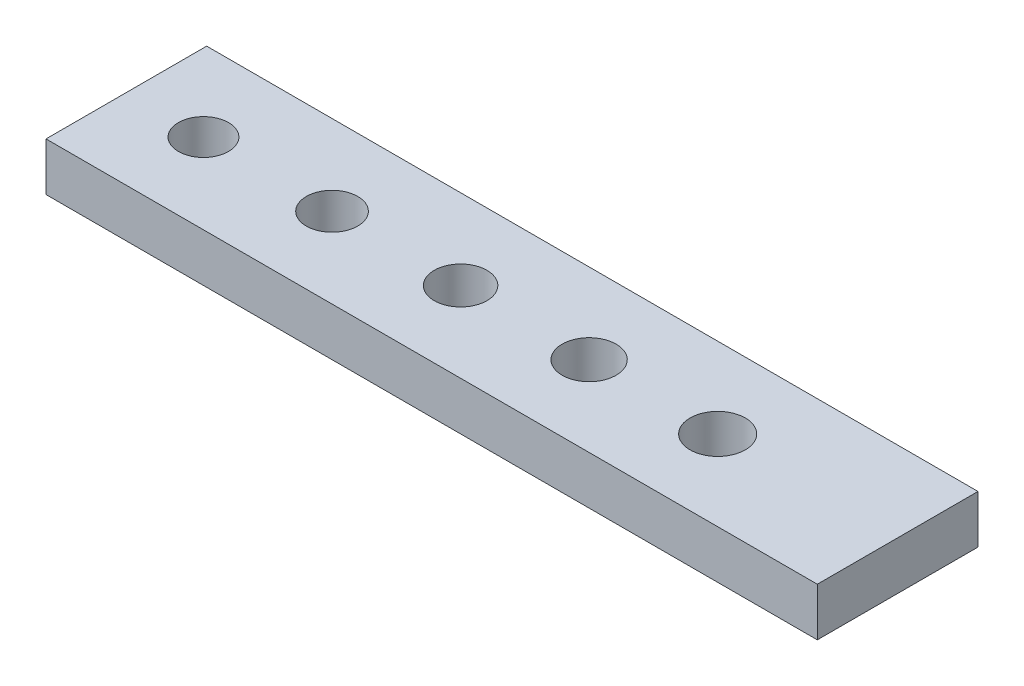
ISO-10303-21;
HEADER;
FILE_DESCRIPTION(('STEP AP214'),'2;1');
FILE_NAME('part.step','',(''),(''),'','','');
FILE_SCHEMA(('AUTOMOTIVE_DESIGN { 1 0 10303 214 1 1 1 1 }'));
ENDSEC;
DATA;
#1=APPLICATION_CONTEXT('core data for automotive mechanical design processes');
#2=APPLICATION_PROTOCOL_DEFINITION('international standard','automotive_design',2000,#1);
#3=PRODUCT_CONTEXT('',#1,'mechanical');
#4=PRODUCT('Part','Part','',(#3));
#5=PRODUCT_RELATED_PRODUCT_CATEGORY('part','',(#4));
#6=PRODUCT_DEFINITION_FORMATION('','',#4);
#7=PRODUCT_DEFINITION_CONTEXT('part definition',#1,'design');
#8=PRODUCT_DEFINITION('design','',#6,#7);
#9=PRODUCT_DEFINITION_SHAPE('','',#8);
#10=(LENGTH_UNIT() NAMED_UNIT(*) SI_UNIT(.MILLI.,.METRE.));
#11=(NAMED_UNIT(*) PLANE_ANGLE_UNIT() SI_UNIT($,.RADIAN.));
#12=(NAMED_UNIT(*) SI_UNIT($,.STERADIAN.) SOLID_ANGLE_UNIT());
#13=UNCERTAINTY_MEASURE_WITH_UNIT(LENGTH_MEASURE(1.E-05),#10,'distance_accuracy_value','');
#14=(GEOMETRIC_REPRESENTATION_CONTEXT(3) GLOBAL_UNCERTAINTY_ASSIGNED_CONTEXT((#13)) GLOBAL_UNIT_ASSIGNED_CONTEXT((#10,
#11,#12)) REPRESENTATION_CONTEXT('',''));
#15=CARTESIAN_POINT('',(0.,0.,0.));
#16=DIRECTION('',(0.,0.,1.));
#17=DIRECTION('',(1.,0.,0.));
#18=AXIS2_PLACEMENT_3D('',#15,#16,#17);
#19=CARTESIAN_POINT('',(0.,1.905,0.));
#20=DIRECTION('',(0.,-1.,0.));
#21=DIRECTION('',(0.,0.,-1.));
#22=AXIS2_PLACEMENT_3D('',#19,#20,#21);
#23=PLANE('',#22);
#24=DIRECTION('',(0.,0.,-1.));
#25=VECTOR('',#24,1.);
#26=CARTESIAN_POINT('',(0.,1.905,0.));
#27=LINE('',#26,#25);
#28=CARTESIAN_POINT('',(0.,1.905,6.35000000000001));
#29=VERTEX_POINT('',#28);
#30=CARTESIAN_POINT('',(0.,1.905,0.));
#31=VERTEX_POINT('',#30);
#32=EDGE_CURVE('E85',#29,#31,#27,.T.);
#33=ORIENTED_EDGE('',*,*,#32,.T.);
#34=DIRECTION('',(-1.,0.,0.));
#35=VECTOR('',#34,1.);
#36=CARTESIAN_POINT('',(0.,1.905,0.));
#37=LINE('',#36,#35);
#38=CARTESIAN_POINT('',(-30.48,1.905,0.));
#39=VERTEX_POINT('',#38);
#40=EDGE_CURVE('E80',#31,#39,#37,.T.);
#41=ORIENTED_EDGE('',*,*,#40,.T.);
#42=DIRECTION('',(0.,0.,1.));
#43=VECTOR('',#42,1.);
#44=CARTESIAN_POINT('',(-30.48,1.905,0.));
#45=LINE('',#44,#43);
#46=CARTESIAN_POINT('',(-30.48,1.905,6.35));
#47=VERTEX_POINT('',#46);
#48=EDGE_CURVE('E83',#39,#47,#45,.T.);
#49=ORIENTED_EDGE('',*,*,#48,.T.);
#50=DIRECTION('',(1.,0.,0.));
#51=VECTOR('',#50,1.);
#52=CARTESIAN_POINT('',(0.,1.905,6.35000000000001));
#53=LINE('',#52,#51);
#54=EDGE_CURVE('E50',#47,#29,#53,.T.);
#55=ORIENTED_EDGE('',*,*,#54,.T.);
#56=EDGE_LOOP('',(#33,#41,#49,#55));
#57=FACE_BOUND('',#56,.T.);
#58=CARTESIAN_POINT('',(-27.432,1.905,3.175));
#59=DIRECTION('',(0.,1.,0.));
#60=DIRECTION('',(0.,0.,1.));
#61=AXIS2_PLACEMENT_3D('',#58,#59,#60);
#62=CIRCLE('',#61,0.990600000000001);
#63=CARTESIAN_POINT('',(-27.432,1.905,2.1844));
#64=VERTEX_POINT('',#63);
#65=EDGE_CURVE('E100',#64,#64,#62,.T.);
#66=ORIENTED_EDGE('',*,*,#65,.F.);
#67=EDGE_LOOP('',(#66));
#68=FACE_BOUND('',#67,.T.);
#69=CARTESIAN_POINT('',(-22.352,1.905,3.175));
#70=DIRECTION('',(0.,1.,0.));
#71=DIRECTION('',(0.,0.,1.));
#72=AXIS2_PLACEMENT_3D('',#69,#70,#71);
#73=CIRCLE('',#72,1.016);
#74=CARTESIAN_POINT('',(-22.352,1.905,2.159));
#75=VERTEX_POINT('',#74);
#76=EDGE_CURVE('E115',#75,#75,#73,.T.);
#77=ORIENTED_EDGE('',*,*,#76,.F.);
#78=EDGE_LOOP('',(#77));
#79=FACE_BOUND('',#78,.T.);
#80=CARTESIAN_POINT('',(-17.272,1.905,3.175));
#81=DIRECTION('',(0.,1.,0.));
#82=DIRECTION('',(0.,0.,1.));
#83=AXIS2_PLACEMENT_3D('',#80,#81,#82);
#84=CIRCLE('',#83,1.0414);
#85=CARTESIAN_POINT('',(-17.272,1.905,2.13360000000001));
#86=VERTEX_POINT('',#85);
#87=EDGE_CURVE('E121',#86,#86,#84,.T.);
#88=ORIENTED_EDGE('',*,*,#87,.F.);
#89=EDGE_LOOP('',(#88));
#90=FACE_BOUND('',#89,.T.);
#91=CARTESIAN_POINT('',(-12.192,1.905,3.175));
#92=DIRECTION('',(0.,1.,0.));
#93=DIRECTION('',(0.,0.,1.));
#94=AXIS2_PLACEMENT_3D('',#91,#92,#93);
#95=CIRCLE('',#94,1.0668);
#96=CARTESIAN_POINT('',(-12.192,1.905,2.1082));
#97=VERTEX_POINT('',#96);
#98=EDGE_CURVE('E127',#97,#97,#95,.T.);
#99=ORIENTED_EDGE('',*,*,#98,.F.);
#100=EDGE_LOOP('',(#99));
#101=FACE_BOUND('',#100,.T.);
#102=CARTESIAN_POINT('',(-7.11199999999999,1.905,3.175));
#103=DIRECTION('',(0.,1.,0.));
#104=DIRECTION('',(0.,0.,1.));
#105=AXIS2_PLACEMENT_3D('',#102,#103,#104);
#106=CIRCLE('',#105,1.0922);
#107=CARTESIAN_POINT('',(-7.11199999999999,1.905,2.0828));
#108=VERTEX_POINT('',#107);
#109=EDGE_CURVE('E133',#108,#108,#106,.T.);
#110=ORIENTED_EDGE('',*,*,#109,.F.);
#111=EDGE_LOOP('',(#110));
#112=FACE_BOUND('',#111,.T.);
#113=ADVANCED_FACE('F33',(#57,#68,#79,#90,#101,#112),#23,.F.);
#114=CARTESIAN_POINT('',(0.,0.,0.));
#115=DIRECTION('',(0.,-1.,0.));
#116=DIRECTION('',(0.,0.,-1.));
#117=AXIS2_PLACEMENT_3D('',#114,#115,#116);
#118=PLANE('',#117);
#119=CARTESIAN_POINT('',(-12.192,0.,3.175));
#120=DIRECTION('',(0.,1.,0.));
#121=DIRECTION('',(0.,0.,1.));
#122=AXIS2_PLACEMENT_3D('',#119,#120,#121);
#123=CIRCLE('',#122,1.0668);
#124=CARTESIAN_POINT('',(-12.192,0.,2.1082));
#125=VERTEX_POINT('',#124);
#126=EDGE_CURVE('E130',#125,#125,#123,.T.);
#127=ORIENTED_EDGE('',*,*,#126,.T.);
#128=EDGE_LOOP('',(#127));
#129=FACE_BOUND('',#128,.T.);
#130=CARTESIAN_POINT('',(-22.352,0.,3.175));
#131=DIRECTION('',(0.,1.,0.));
#132=DIRECTION('',(0.,0.,1.));
#133=AXIS2_PLACEMENT_3D('',#130,#131,#132);
#134=CIRCLE('',#133,1.016);
#135=CARTESIAN_POINT('',(-22.352,0.,2.159));
#136=VERTEX_POINT('',#135);
#137=EDGE_CURVE('E118',#136,#136,#134,.T.);
#138=ORIENTED_EDGE('',*,*,#137,.T.);
#139=EDGE_LOOP('',(#138));
#140=FACE_BOUND('',#139,.T.);
#141=DIRECTION('',(0.,0.,-1.));
#142=VECTOR('',#141,1.);
#143=CARTESIAN_POINT('',(0.,0.,0.));
#144=LINE('',#143,#142);
#145=CARTESIAN_POINT('',(0.,0.,6.35000000000001));
#146=VERTEX_POINT('',#145);
#147=CARTESIAN_POINT('',(0.,0.,0.));
#148=VERTEX_POINT('',#147);
#149=EDGE_CURVE('E97',#146,#148,#144,.T.);
#150=ORIENTED_EDGE('',*,*,#149,.F.);
#151=DIRECTION('',(1.,0.,0.));
#152=VECTOR('',#151,1.);
#153=CARTESIAN_POINT('',(0.,0.,6.35000000000001));
#154=LINE('',#153,#152);
#155=CARTESIAN_POINT('',(-30.48,0.,6.35));
#156=VERTEX_POINT('',#155);
#157=EDGE_CURVE('E73',#156,#146,#154,.T.);
#158=ORIENTED_EDGE('',*,*,#157,.F.);
#159=DIRECTION('',(0.,0.,1.));
#160=VECTOR('',#159,1.);
#161=CARTESIAN_POINT('',(-30.48,0.,0.));
#162=LINE('',#161,#160);
#163=CARTESIAN_POINT('',(-30.48,0.,0.));
#164=VERTEX_POINT('',#163);
#165=EDGE_CURVE('E67',#164,#156,#162,.T.);
#166=ORIENTED_EDGE('',*,*,#165,.F.);
#167=DIRECTION('',(-1.,0.,0.));
#168=VECTOR('',#167,1.);
#169=CARTESIAN_POINT('',(0.,0.,0.));
#170=LINE('',#169,#168);
#171=EDGE_CURVE('E89',#148,#164,#170,.T.);
#172=ORIENTED_EDGE('',*,*,#171,.F.);
#173=EDGE_LOOP('',(#150,#158,#166,#172));
#174=FACE_BOUND('',#173,.T.);
#175=CARTESIAN_POINT('',(-27.432,0.,3.175));
#176=DIRECTION('',(0.,1.,0.));
#177=DIRECTION('',(0.,0.,1.));
#178=AXIS2_PLACEMENT_3D('',#175,#176,#177);
#179=CIRCLE('',#178,0.990600000000001);
#180=CARTESIAN_POINT('',(-27.432,0.,2.1844));
#181=VERTEX_POINT('',#180);
#182=EDGE_CURVE('E112',#181,#181,#179,.T.);
#183=ORIENTED_EDGE('',*,*,#182,.T.);
#184=EDGE_LOOP('',(#183));
#185=FACE_BOUND('',#184,.T.);
#186=CARTESIAN_POINT('',(-17.272,0.,3.175));
#187=DIRECTION('',(0.,1.,0.));
#188=DIRECTION('',(0.,0.,1.));
#189=AXIS2_PLACEMENT_3D('',#186,#187,#188);
#190=CIRCLE('',#189,1.0414);
#191=CARTESIAN_POINT('',(-17.272,0.,2.13360000000001));
#192=VERTEX_POINT('',#191);
#193=EDGE_CURVE('E124',#192,#192,#190,.T.);
#194=ORIENTED_EDGE('',*,*,#193,.T.);
#195=EDGE_LOOP('',(#194));
#196=FACE_BOUND('',#195,.T.);
#197=CARTESIAN_POINT('',(-7.11199999999999,0.,3.175));
#198=DIRECTION('',(0.,1.,0.));
#199=DIRECTION('',(0.,0.,1.));
#200=AXIS2_PLACEMENT_3D('',#197,#198,#199);
#201=CIRCLE('',#200,1.0922);
#202=CARTESIAN_POINT('',(-7.11199999999999,0.,2.0828));
#203=VERTEX_POINT('',#202);
#204=EDGE_CURVE('E136',#203,#203,#201,.T.);
#205=ORIENTED_EDGE('',*,*,#204,.T.);
#206=EDGE_LOOP('',(#205));
#207=FACE_BOUND('',#206,.T.);
#208=ADVANCED_FACE('F108',(#129,#140,#174,#185,#196,#207),#118,.T.);
#209=CARTESIAN_POINT('',(0.,1.905,0.));
#210=DIRECTION('',(-1.,0.,0.));
#211=DIRECTION('',(0.,0.,1.));
#212=AXIS2_PLACEMENT_3D('',#209,#210,#211);
#213=PLANE('',#212);
#214=ORIENTED_EDGE('',*,*,#149,.T.);
#215=DIRECTION('',(0.,-1.,0.));
#216=VECTOR('',#215,1.);
#217=CARTESIAN_POINT('',(0.,1.905,0.));
#218=LINE('',#217,#216);
#219=EDGE_CURVE('E11',#31,#148,#218,.T.);
#220=ORIENTED_EDGE('',*,*,#219,.F.);
#221=ORIENTED_EDGE('',*,*,#32,.F.);
#222=DIRECTION('',(0.,-1.,0.));
#223=VECTOR('',#222,1.);
#224=CARTESIAN_POINT('',(0.,1.905,6.35000000000001));
#225=LINE('',#224,#223);
#226=EDGE_CURVE('E93',#29,#146,#225,.T.);
#227=ORIENTED_EDGE('',*,*,#226,.T.);
#228=EDGE_LOOP('',(#214,#220,#221,#227));
#229=FACE_BOUND('',#228,.T.);
#230=ADVANCED_FACE('F35',(#229),#213,.F.);
#231=CARTESIAN_POINT('',(0.,1.905,0.));
#232=DIRECTION('',(0.,0.,1.));
#233=DIRECTION('',(1.,0.,0.));
#234=AXIS2_PLACEMENT_3D('',#231,#232,#233);
#235=PLANE('',#234);
#236=ORIENTED_EDGE('',*,*,#171,.T.);
#237=DIRECTION('',(0.,-1.,0.));
#238=VECTOR('',#237,1.);
#239=CARTESIAN_POINT('',(-30.48,1.905,0.));
#240=LINE('',#239,#238);
#241=EDGE_CURVE('E42',#39,#164,#240,.T.);
#242=ORIENTED_EDGE('',*,*,#241,.F.);
#243=ORIENTED_EDGE('',*,*,#40,.F.);
#244=ORIENTED_EDGE('',*,*,#219,.T.);
#245=EDGE_LOOP('',(#236,#242,#243,#244));
#246=FACE_BOUND('',#245,.T.);
#247=ADVANCED_FACE('F88',(#246),#235,.F.);
#248=CARTESIAN_POINT('',(-30.48,1.905,0.));
#249=DIRECTION('',(1.,0.,0.));
#250=DIRECTION('',(0.,0.,-1.));
#251=AXIS2_PLACEMENT_3D('',#248,#249,#250);
#252=PLANE('',#251);
#253=ORIENTED_EDGE('',*,*,#165,.T.);
#254=DIRECTION('',(0.,-1.,0.));
#255=VECTOR('',#254,1.);
#256=CARTESIAN_POINT('',(-30.48,1.905,6.35));
#257=LINE('',#256,#255);
#258=EDGE_CURVE('E90',#47,#156,#257,.T.);
#259=ORIENTED_EDGE('',*,*,#258,.F.);
#260=ORIENTED_EDGE('',*,*,#48,.F.);
#261=ORIENTED_EDGE('',*,*,#241,.T.);
#262=EDGE_LOOP('',(#253,#259,#260,#261));
#263=FACE_BOUND('',#262,.T.);
#264=ADVANCED_FACE('F91',(#263),#252,.F.);
#265=CARTESIAN_POINT('',(0.,1.905,6.35000000000001));
#266=DIRECTION('',(0.,0.,-1.));
#267=DIRECTION('',(-1.,0.,0.));
#268=AXIS2_PLACEMENT_3D('',#265,#266,#267);
#269=PLANE('',#268);
#270=ORIENTED_EDGE('',*,*,#157,.T.);
#271=ORIENTED_EDGE('',*,*,#226,.F.);
#272=ORIENTED_EDGE('',*,*,#54,.F.);
#273=ORIENTED_EDGE('',*,*,#258,.T.);
#274=EDGE_LOOP('',(#270,#271,#272,#273));
#275=FACE_BOUND('',#274,.T.);
#276=ADVANCED_FACE('F105',(#275),#269,.F.);
#277=CARTESIAN_POINT('',(-27.432,1.905,3.175));
#278=DIRECTION('',(0.,-1.,0.));
#279=DIRECTION('',(0.,0.,-1.));
#280=AXIS2_PLACEMENT_3D('',#277,#278,#279);
#281=CYLINDRICAL_SURFACE('',#280,0.990600000000001);
#282=CARTESIAN_POINT('',(-27.432,1.905,2.1844));
#283=CARTESIAN_POINT('',(-27.432,1.88515625,2.1844));
#284=CARTESIAN_POINT('',(-27.432,1.8653125,2.1844));
#285=CARTESIAN_POINT('',(-27.432,1.825625,2.1844));
#286=CARTESIAN_POINT('',(-27.432,1.80578125,2.1844));
#287=CARTESIAN_POINT('',(-27.432,1.76609375,2.1844));
#288=CARTESIAN_POINT('',(-27.432,1.74625,2.1844));
#289=CARTESIAN_POINT('',(-27.432,1.7065625,2.1844));
#290=CARTESIAN_POINT('',(-27.432,1.68671875,2.1844));
#291=CARTESIAN_POINT('',(-27.432,1.64703125,2.1844));
#292=CARTESIAN_POINT('',(-27.432,1.6271875,2.1844));
#293=CARTESIAN_POINT('',(-27.432,1.5875,2.1844));
#294=CARTESIAN_POINT('',(-27.432,1.56765625,2.1844));
#295=CARTESIAN_POINT('',(-27.432,1.52796875,2.1844));
#296=CARTESIAN_POINT('',(-27.432,1.508125,2.1844));
#297=CARTESIAN_POINT('',(-27.432,1.4684375,2.1844));
#298=CARTESIAN_POINT('',(-27.432,1.44859375,2.1844));
#299=CARTESIAN_POINT('',(-27.432,1.40890625,2.1844));
#300=CARTESIAN_POINT('',(-27.432,1.3890625,2.1844));
#301=CARTESIAN_POINT('',(-27.432,1.349375,2.1844));
#302=CARTESIAN_POINT('',(-27.432,1.32953125,2.1844));
#303=CARTESIAN_POINT('',(-27.432,1.28984375,2.1844));
#304=CARTESIAN_POINT('',(-27.432,1.27,2.1844));
#305=CARTESIAN_POINT('',(-27.432,1.2303125,2.1844));
#306=CARTESIAN_POINT('',(-27.432,1.21046875,2.1844));
#307=CARTESIAN_POINT('',(-27.432,1.17078125,2.1844));
#308=CARTESIAN_POINT('',(-27.432,1.1509375,2.1844));
#309=CARTESIAN_POINT('',(-27.432,1.11125,2.1844));
#310=CARTESIAN_POINT('',(-27.432,1.09140625,2.1844));
#311=CARTESIAN_POINT('',(-27.432,1.05171875,2.1844));
#312=CARTESIAN_POINT('',(-27.432,1.031875,2.1844));
#313=CARTESIAN_POINT('',(-27.432,0.9921875,2.1844));
#314=CARTESIAN_POINT('',(-27.432,0.97234375,2.1844));
#315=CARTESIAN_POINT('',(-27.432,0.93265625,2.1844));
#316=CARTESIAN_POINT('',(-27.432,0.9128125,2.1844));
#317=CARTESIAN_POINT('',(-27.432,0.873125,2.1844));
#318=CARTESIAN_POINT('',(-27.432,0.85328125,2.1844));
#319=CARTESIAN_POINT('',(-27.432,0.81359375,2.1844));
#320=CARTESIAN_POINT('',(-27.432,0.79375,2.1844));
#321=CARTESIAN_POINT('',(-27.432,0.7540625,2.1844));
#322=CARTESIAN_POINT('',(-27.432,0.73421875,2.1844));
#323=CARTESIAN_POINT('',(-27.432,0.69453125,2.1844));
#324=CARTESIAN_POINT('',(-27.432,0.6746875,2.1844));
#325=CARTESIAN_POINT('',(-27.432,0.635,2.1844));
#326=CARTESIAN_POINT('',(-27.432,0.61515625,2.1844));
#327=CARTESIAN_POINT('',(-27.432,0.57546875,2.1844));
#328=CARTESIAN_POINT('',(-27.432,0.555625,2.1844));
#329=CARTESIAN_POINT('',(-27.432,0.5159375,2.1844));
#330=CARTESIAN_POINT('',(-27.432,0.49609375,2.1844));
#331=CARTESIAN_POINT('',(-27.432,0.45640625,2.1844));
#332=CARTESIAN_POINT('',(-27.432,0.4365625,2.1844));
#333=CARTESIAN_POINT('',(-27.432,0.396875,2.1844));
#334=CARTESIAN_POINT('',(-27.432,0.37703125,2.1844));
#335=CARTESIAN_POINT('',(-27.432,0.33734375,2.1844));
#336=CARTESIAN_POINT('',(-27.432,0.3175,2.1844));
#337=CARTESIAN_POINT('',(-27.432,0.2778125,2.1844));
#338=CARTESIAN_POINT('',(-27.432,0.25796875,2.1844));
#339=CARTESIAN_POINT('',(-27.432,0.21828125,2.1844));
#340=CARTESIAN_POINT('',(-27.432,0.1984375,2.1844));
#341=CARTESIAN_POINT('',(-27.432,0.15875,2.1844));
#342=CARTESIAN_POINT('',(-27.432,0.13890625,2.1844));
#343=CARTESIAN_POINT('',(-27.432,0.09921875,2.1844));
#344=CARTESIAN_POINT('',(-27.432,0.0793749999999999,2.1844));
#345=CARTESIAN_POINT('',(-27.432,0.0396874999999999,2.1844));
#346=CARTESIAN_POINT('',(-27.432,0.01984375,2.1844));
#347=CARTESIAN_POINT('',(-27.432,0.,2.1844));
#348=B_SPLINE_CURVE_WITH_KNOTS('',3,(#282,#283,#284,#285,#286,#287,#288,#289,#290,#291,#292,
#293,#294,#295,#296,#297,#298,#299,#300,#301,#302,#303,#304,#305,#306,#307,#308,#309,#310,#311,
#312,#313,#314,#315,#316,#317,#318,#319,#320,#321,#322,#323,#324,#325,#326,#327,#328,#329,#330,
#331,#332,#333,#334,#335,#336,#337,#338,#339,#340,#341,#342,#343,#344,#345,#346,#347),
.UNSPECIFIED.,.F.,.F.,(4,2,2,2,2,2,2,2,2,2,2,2,2,2,2,2,2,2,2,2,2,2,2,2,2,2,2,2,2,2,2,2,4),(0.,
0.0595312500000001,0.1190625,0.17859375,0.238125,0.29765625,0.3571875,0.41671875,0.47625,
0.53578125,0.5953125,0.65484375,0.714375,0.77390625,0.8334375,0.89296875,0.9525,1.01203125,
1.0715625,1.13109375,1.190625,1.25015625,1.3096875,1.36921875,1.42875,1.48828125,1.5478125,
1.60734375,1.666875,1.72640625,1.7859375,1.84546875,1.905),.UNSPECIFIED.);
#349=EDGE_CURVE('BSEAM153',#64,#181,#348,.T.);
#350=ORIENTED_EDGE('',*,*,#65,.T.);
#351=ORIENTED_EDGE('',*,*,#182,.F.);
#352=ORIENTED_EDGE('',*,*,#349,.T.);
#353=ORIENTED_EDGE('',*,*,#349,.F.);
#354=EDGE_LOOP('',(#350,#352,#351,#353));
#355=FACE_BOUND('',#354,.T.);
#356=ADVANCED_FACE('F153',(#355),#281,.F.);
#357=CARTESIAN_POINT('',(-22.352,1.905,3.175));
#358=DIRECTION('',(0.,-1.,0.));
#359=DIRECTION('',(0.,0.,-1.));
#360=AXIS2_PLACEMENT_3D('',#357,#358,#359);
#361=CYLINDRICAL_SURFACE('',#360,1.016);
#362=CARTESIAN_POINT('',(-22.352,1.905,2.159));
#363=CARTESIAN_POINT('',(-22.352,1.88515625,2.159));
#364=CARTESIAN_POINT('',(-22.352,1.8653125,2.159));
#365=CARTESIAN_POINT('',(-22.352,1.825625,2.159));
#366=CARTESIAN_POINT('',(-22.352,1.80578125,2.159));
#367=CARTESIAN_POINT('',(-22.352,1.76609375,2.159));
#368=CARTESIAN_POINT('',(-22.352,1.74625,2.159));
#369=CARTESIAN_POINT('',(-22.352,1.7065625,2.159));
#370=CARTESIAN_POINT('',(-22.352,1.68671875,2.159));
#371=CARTESIAN_POINT('',(-22.352,1.64703125,2.159));
#372=CARTESIAN_POINT('',(-22.352,1.6271875,2.159));
#373=CARTESIAN_POINT('',(-22.352,1.5875,2.159));
#374=CARTESIAN_POINT('',(-22.352,1.56765625,2.159));
#375=CARTESIAN_POINT('',(-22.352,1.52796875,2.159));
#376=CARTESIAN_POINT('',(-22.352,1.508125,2.159));
#377=CARTESIAN_POINT('',(-22.352,1.4684375,2.159));
#378=CARTESIAN_POINT('',(-22.352,1.44859375,2.159));
#379=CARTESIAN_POINT('',(-22.352,1.40890625,2.159));
#380=CARTESIAN_POINT('',(-22.352,1.3890625,2.159));
#381=CARTESIAN_POINT('',(-22.352,1.349375,2.159));
#382=CARTESIAN_POINT('',(-22.352,1.32953125,2.159));
#383=CARTESIAN_POINT('',(-22.352,1.28984375,2.159));
#384=CARTESIAN_POINT('',(-22.352,1.27,2.159));
#385=CARTESIAN_POINT('',(-22.352,1.2303125,2.159));
#386=CARTESIAN_POINT('',(-22.352,1.21046875,2.159));
#387=CARTESIAN_POINT('',(-22.352,1.17078125,2.159));
#388=CARTESIAN_POINT('',(-22.352,1.1509375,2.159));
#389=CARTESIAN_POINT('',(-22.352,1.11125,2.159));
#390=CARTESIAN_POINT('',(-22.352,1.09140625,2.159));
#391=CARTESIAN_POINT('',(-22.352,1.05171875,2.159));
#392=CARTESIAN_POINT('',(-22.352,1.031875,2.159));
#393=CARTESIAN_POINT('',(-22.352,0.9921875,2.159));
#394=CARTESIAN_POINT('',(-22.352,0.97234375,2.159));
#395=CARTESIAN_POINT('',(-22.352,0.93265625,2.159));
#396=CARTESIAN_POINT('',(-22.352,0.9128125,2.159));
#397=CARTESIAN_POINT('',(-22.352,0.873125,2.159));
#398=CARTESIAN_POINT('',(-22.352,0.85328125,2.159));
#399=CARTESIAN_POINT('',(-22.352,0.81359375,2.159));
#400=CARTESIAN_POINT('',(-22.352,0.79375,2.159));
#401=CARTESIAN_POINT('',(-22.352,0.7540625,2.159));
#402=CARTESIAN_POINT('',(-22.352,0.73421875,2.159));
#403=CARTESIAN_POINT('',(-22.352,0.69453125,2.159));
#404=CARTESIAN_POINT('',(-22.352,0.6746875,2.159));
#405=CARTESIAN_POINT('',(-22.352,0.635,2.159));
#406=CARTESIAN_POINT('',(-22.352,0.61515625,2.159));
#407=CARTESIAN_POINT('',(-22.352,0.57546875,2.159));
#408=CARTESIAN_POINT('',(-22.352,0.555625,2.159));
#409=CARTESIAN_POINT('',(-22.352,0.5159375,2.159));
#410=CARTESIAN_POINT('',(-22.352,0.49609375,2.159));
#411=CARTESIAN_POINT('',(-22.352,0.45640625,2.159));
#412=CARTESIAN_POINT('',(-22.352,0.4365625,2.159));
#413=CARTESIAN_POINT('',(-22.352,0.396875,2.159));
#414=CARTESIAN_POINT('',(-22.352,0.37703125,2.159));
#415=CARTESIAN_POINT('',(-22.352,0.33734375,2.159));
#416=CARTESIAN_POINT('',(-22.352,0.3175,2.159));
#417=CARTESIAN_POINT('',(-22.352,0.2778125,2.159));
#418=CARTESIAN_POINT('',(-22.352,0.25796875,2.159));
#419=CARTESIAN_POINT('',(-22.352,0.21828125,2.159));
#420=CARTESIAN_POINT('',(-22.352,0.1984375,2.159));
#421=CARTESIAN_POINT('',(-22.352,0.15875,2.159));
#422=CARTESIAN_POINT('',(-22.352,0.13890625,2.159));
#423=CARTESIAN_POINT('',(-22.352,0.09921875,2.159));
#424=CARTESIAN_POINT('',(-22.352,0.0793749999999999,2.159));
#425=CARTESIAN_POINT('',(-22.352,0.0396874999999999,2.159));
#426=CARTESIAN_POINT('',(-22.352,0.01984375,2.159));
#427=CARTESIAN_POINT('',(-22.352,0.,2.159));
#428=B_SPLINE_CURVE_WITH_KNOTS('',3,(#362,#363,#364,#365,#366,#367,#368,#369,#370,#371,#372,
#373,#374,#375,#376,#377,#378,#379,#380,#381,#382,#383,#384,#385,#386,#387,#388,#389,#390,#391,
#392,#393,#394,#395,#396,#397,#398,#399,#400,#401,#402,#403,#404,#405,#406,#407,#408,#409,#410,
#411,#412,#413,#414,#415,#416,#417,#418,#419,#420,#421,#422,#423,#424,#425,#426,#427),
.UNSPECIFIED.,.F.,.F.,(4,2,2,2,2,2,2,2,2,2,2,2,2,2,2,2,2,2,2,2,2,2,2,2,2,2,2,2,2,2,2,2,4),(0.,
0.0595312500000001,0.1190625,0.17859375,0.238125,0.29765625,0.3571875,0.41671875,0.47625,
0.53578125,0.5953125,0.65484375,0.714375,0.77390625,0.8334375,0.89296875,0.9525,1.01203125,
1.0715625,1.13109375,1.190625,1.25015625,1.3096875,1.36921875,1.42875,1.48828125,1.5478125,
1.60734375,1.666875,1.72640625,1.7859375,1.84546875,1.905),.UNSPECIFIED.);
#429=EDGE_CURVE('BSEAM199',#75,#136,#428,.T.);
#430=ORIENTED_EDGE('',*,*,#76,.T.);
#431=ORIENTED_EDGE('',*,*,#137,.F.);
#432=ORIENTED_EDGE('',*,*,#429,.T.);
#433=ORIENTED_EDGE('',*,*,#429,.F.);
#434=EDGE_LOOP('',(#430,#432,#431,#433));
#435=FACE_BOUND('',#434,.T.);
#436=ADVANCED_FACE('F199',(#435),#361,.F.);
#437=CARTESIAN_POINT('',(-17.272,1.905,3.175));
#438=DIRECTION('',(0.,-1.,0.));
#439=DIRECTION('',(0.,0.,-1.));
#440=AXIS2_PLACEMENT_3D('',#437,#438,#439);
#441=CYLINDRICAL_SURFACE('',#440,1.0414);
#442=CARTESIAN_POINT('',(-17.272,1.905,2.13360000000001));
#443=CARTESIAN_POINT('',(-17.272,1.88515625,2.13360000000001));
#444=CARTESIAN_POINT('',(-17.272,1.8653125,2.13360000000001));
#445=CARTESIAN_POINT('',(-17.272,1.825625,2.13360000000001));
#446=CARTESIAN_POINT('',(-17.272,1.80578125,2.13360000000001));
#447=CARTESIAN_POINT('',(-17.272,1.76609375,2.13360000000001));
#448=CARTESIAN_POINT('',(-17.272,1.74625,2.13360000000001));
#449=CARTESIAN_POINT('',(-17.272,1.7065625,2.13360000000001));
#450=CARTESIAN_POINT('',(-17.272,1.68671875,2.13360000000001));
#451=CARTESIAN_POINT('',(-17.272,1.64703125,2.13360000000001));
#452=CARTESIAN_POINT('',(-17.272,1.6271875,2.13360000000001));
#453=CARTESIAN_POINT('',(-17.272,1.5875,2.13360000000001));
#454=CARTESIAN_POINT('',(-17.272,1.56765625,2.13360000000001));
#455=CARTESIAN_POINT('',(-17.272,1.52796875,2.13360000000001));
#456=CARTESIAN_POINT('',(-17.272,1.508125,2.13360000000001));
#457=CARTESIAN_POINT('',(-17.272,1.4684375,2.13360000000001));
#458=CARTESIAN_POINT('',(-17.272,1.44859375,2.13360000000001));
#459=CARTESIAN_POINT('',(-17.272,1.40890625,2.13360000000001));
#460=CARTESIAN_POINT('',(-17.272,1.3890625,2.13360000000001));
#461=CARTESIAN_POINT('',(-17.272,1.349375,2.13360000000001));
#462=CARTESIAN_POINT('',(-17.272,1.32953125,2.13360000000001));
#463=CARTESIAN_POINT('',(-17.272,1.28984375,2.13360000000001));
#464=CARTESIAN_POINT('',(-17.272,1.27,2.13360000000001));
#465=CARTESIAN_POINT('',(-17.272,1.2303125,2.13360000000001));
#466=CARTESIAN_POINT('',(-17.272,1.21046875,2.13360000000001));
#467=CARTESIAN_POINT('',(-17.272,1.17078125,2.13360000000001));
#468=CARTESIAN_POINT('',(-17.272,1.1509375,2.13360000000001));
#469=CARTESIAN_POINT('',(-17.272,1.11125,2.13360000000001));
#470=CARTESIAN_POINT('',(-17.272,1.09140625,2.13360000000001));
#471=CARTESIAN_POINT('',(-17.272,1.05171875,2.13360000000001));
#472=CARTESIAN_POINT('',(-17.272,1.031875,2.13360000000001));
#473=CARTESIAN_POINT('',(-17.272,0.9921875,2.13360000000001));
#474=CARTESIAN_POINT('',(-17.272,0.97234375,2.13360000000001));
#475=CARTESIAN_POINT('',(-17.272,0.93265625,2.13360000000001));
#476=CARTESIAN_POINT('',(-17.272,0.9128125,2.13360000000001));
#477=CARTESIAN_POINT('',(-17.272,0.873125,2.13360000000001));
#478=CARTESIAN_POINT('',(-17.272,0.85328125,2.13360000000001));
#479=CARTESIAN_POINT('',(-17.272,0.81359375,2.13360000000001));
#480=CARTESIAN_POINT('',(-17.272,0.79375,2.13360000000001));
#481=CARTESIAN_POINT('',(-17.272,0.7540625,2.13360000000001));
#482=CARTESIAN_POINT('',(-17.272,0.73421875,2.13360000000001));
#483=CARTESIAN_POINT('',(-17.272,0.69453125,2.13360000000001));
#484=CARTESIAN_POINT('',(-17.272,0.6746875,2.13360000000001));
#485=CARTESIAN_POINT('',(-17.272,0.635,2.13360000000001));
#486=CARTESIAN_POINT('',(-17.272,0.61515625,2.13360000000001));
#487=CARTESIAN_POINT('',(-17.272,0.57546875,2.13360000000001));
#488=CARTESIAN_POINT('',(-17.272,0.555625,2.13360000000001));
#489=CARTESIAN_POINT('',(-17.272,0.5159375,2.13360000000001));
#490=CARTESIAN_POINT('',(-17.272,0.49609375,2.13360000000001));
#491=CARTESIAN_POINT('',(-17.272,0.45640625,2.13360000000001));
#492=CARTESIAN_POINT('',(-17.272,0.4365625,2.13360000000001));
#493=CARTESIAN_POINT('',(-17.272,0.396875,2.13360000000001));
#494=CARTESIAN_POINT('',(-17.272,0.37703125,2.13360000000001));
#495=CARTESIAN_POINT('',(-17.272,0.33734375,2.13360000000001));
#496=CARTESIAN_POINT('',(-17.272,0.3175,2.13360000000001));
#497=CARTESIAN_POINT('',(-17.272,0.2778125,2.13360000000001));
#498=CARTESIAN_POINT('',(-17.272,0.25796875,2.13360000000001));
#499=CARTESIAN_POINT('',(-17.272,0.21828125,2.13360000000001));
#500=CARTESIAN_POINT('',(-17.272,0.1984375,2.13360000000001));
#501=CARTESIAN_POINT('',(-17.272,0.15875,2.13360000000001));
#502=CARTESIAN_POINT('',(-17.272,0.13890625,2.13360000000001));
#503=CARTESIAN_POINT('',(-17.272,0.09921875,2.13360000000001));
#504=CARTESIAN_POINT('',(-17.272,0.0793749999999999,2.13360000000001));
#505=CARTESIAN_POINT('',(-17.272,0.0396874999999999,2.13360000000001));
#506=CARTESIAN_POINT('',(-17.272,0.01984375,2.13360000000001));
#507=CARTESIAN_POINT('',(-17.272,0.,2.13360000000001));
#508=B_SPLINE_CURVE_WITH_KNOTS('',3,(#442,#443,#444,#445,#446,#447,#448,#449,#450,#451,#452,
#453,#454,#455,#456,#457,#458,#459,#460,#461,#462,#463,#464,#465,#466,#467,#468,#469,#470,#471,
#472,#473,#474,#475,#476,#477,#478,#479,#480,#481,#482,#483,#484,#485,#486,#487,#488,#489,#490,
#491,#492,#493,#494,#495,#496,#497,#498,#499,#500,#501,#502,#503,#504,#505,#506,#507),
.UNSPECIFIED.,.F.,.F.,(4,2,2,2,2,2,2,2,2,2,2,2,2,2,2,2,2,2,2,2,2,2,2,2,2,2,2,2,2,2,2,2,4),(0.,
0.0595312500000001,0.1190625,0.17859375,0.238125,0.29765625,0.3571875,0.41671875,0.47625,
0.53578125,0.5953125,0.65484375,0.714375,0.77390625,0.8334375,0.89296875,0.9525,1.01203125,
1.0715625,1.13109375,1.190625,1.25015625,1.3096875,1.36921875,1.42875,1.48828125,1.5478125,
1.60734375,1.666875,1.72640625,1.7859375,1.84546875,1.905),.UNSPECIFIED.);
#509=EDGE_CURVE('BSEAM207',#86,#192,#508,.T.);
#510=ORIENTED_EDGE('',*,*,#87,.T.);
#511=ORIENTED_EDGE('',*,*,#193,.F.);
#512=ORIENTED_EDGE('',*,*,#509,.T.);
#513=ORIENTED_EDGE('',*,*,#509,.F.);
#514=EDGE_LOOP('',(#510,#512,#511,#513));
#515=FACE_BOUND('',#514,.T.);
#516=ADVANCED_FACE('F207',(#515),#441,.F.);
#517=CARTESIAN_POINT('',(-12.192,1.905,3.175));
#518=DIRECTION('',(0.,-1.,0.));
#519=DIRECTION('',(0.,0.,-1.));
#520=AXIS2_PLACEMENT_3D('',#517,#518,#519);
#521=CYLINDRICAL_SURFACE('',#520,1.0668);
#522=CARTESIAN_POINT('',(-12.192,1.905,2.1082));
#523=CARTESIAN_POINT('',(-12.192,1.88515625,2.1082));
#524=CARTESIAN_POINT('',(-12.192,1.8653125,2.1082));
#525=CARTESIAN_POINT('',(-12.192,1.825625,2.1082));
#526=CARTESIAN_POINT('',(-12.192,1.80578125,2.1082));
#527=CARTESIAN_POINT('',(-12.192,1.76609375,2.1082));
#528=CARTESIAN_POINT('',(-12.192,1.74625,2.1082));
#529=CARTESIAN_POINT('',(-12.192,1.7065625,2.1082));
#530=CARTESIAN_POINT('',(-12.192,1.68671875,2.1082));
#531=CARTESIAN_POINT('',(-12.192,1.64703125,2.1082));
#532=CARTESIAN_POINT('',(-12.192,1.6271875,2.1082));
#533=CARTESIAN_POINT('',(-12.192,1.5875,2.1082));
#534=CARTESIAN_POINT('',(-12.192,1.56765625,2.1082));
#535=CARTESIAN_POINT('',(-12.192,1.52796875,2.1082));
#536=CARTESIAN_POINT('',(-12.192,1.508125,2.1082));
#537=CARTESIAN_POINT('',(-12.192,1.4684375,2.1082));
#538=CARTESIAN_POINT('',(-12.192,1.44859375,2.1082));
#539=CARTESIAN_POINT('',(-12.192,1.40890625,2.1082));
#540=CARTESIAN_POINT('',(-12.192,1.3890625,2.1082));
#541=CARTESIAN_POINT('',(-12.192,1.349375,2.1082));
#542=CARTESIAN_POINT('',(-12.192,1.32953125,2.1082));
#543=CARTESIAN_POINT('',(-12.192,1.28984375,2.1082));
#544=CARTESIAN_POINT('',(-12.192,1.27,2.1082));
#545=CARTESIAN_POINT('',(-12.192,1.2303125,2.1082));
#546=CARTESIAN_POINT('',(-12.192,1.21046875,2.1082));
#547=CARTESIAN_POINT('',(-12.192,1.17078125,2.1082));
#548=CARTESIAN_POINT('',(-12.192,1.1509375,2.1082));
#549=CARTESIAN_POINT('',(-12.192,1.11125,2.1082));
#550=CARTESIAN_POINT('',(-12.192,1.09140625,2.1082));
#551=CARTESIAN_POINT('',(-12.192,1.05171875,2.1082));
#552=CARTESIAN_POINT('',(-12.192,1.031875,2.1082));
#553=CARTESIAN_POINT('',(-12.192,0.9921875,2.1082));
#554=CARTESIAN_POINT('',(-12.192,0.97234375,2.1082));
#555=CARTESIAN_POINT('',(-12.192,0.93265625,2.1082));
#556=CARTESIAN_POINT('',(-12.192,0.9128125,2.1082));
#557=CARTESIAN_POINT('',(-12.192,0.873125,2.1082));
#558=CARTESIAN_POINT('',(-12.192,0.85328125,2.1082));
#559=CARTESIAN_POINT('',(-12.192,0.81359375,2.1082));
#560=CARTESIAN_POINT('',(-12.192,0.79375,2.1082));
#561=CARTESIAN_POINT('',(-12.192,0.7540625,2.1082));
#562=CARTESIAN_POINT('',(-12.192,0.73421875,2.1082));
#563=CARTESIAN_POINT('',(-12.192,0.69453125,2.1082));
#564=CARTESIAN_POINT('',(-12.192,0.6746875,2.1082));
#565=CARTESIAN_POINT('',(-12.192,0.635,2.1082));
#566=CARTESIAN_POINT('',(-12.192,0.61515625,2.1082));
#567=CARTESIAN_POINT('',(-12.192,0.57546875,2.1082));
#568=CARTESIAN_POINT('',(-12.192,0.555625,2.1082));
#569=CARTESIAN_POINT('',(-12.192,0.5159375,2.1082));
#570=CARTESIAN_POINT('',(-12.192,0.49609375,2.1082));
#571=CARTESIAN_POINT('',(-12.192,0.45640625,2.1082));
#572=CARTESIAN_POINT('',(-12.192,0.4365625,2.1082));
#573=CARTESIAN_POINT('',(-12.192,0.396875,2.1082));
#574=CARTESIAN_POINT('',(-12.192,0.37703125,2.1082));
#575=CARTESIAN_POINT('',(-12.192,0.33734375,2.1082));
#576=CARTESIAN_POINT('',(-12.192,0.3175,2.1082));
#577=CARTESIAN_POINT('',(-12.192,0.2778125,2.1082));
#578=CARTESIAN_POINT('',(-12.192,0.25796875,2.1082));
#579=CARTESIAN_POINT('',(-12.192,0.21828125,2.1082));
#580=CARTESIAN_POINT('',(-12.192,0.1984375,2.1082));
#581=CARTESIAN_POINT('',(-12.192,0.15875,2.1082));
#582=CARTESIAN_POINT('',(-12.192,0.13890625,2.1082));
#583=CARTESIAN_POINT('',(-12.192,0.09921875,2.1082));
#584=CARTESIAN_POINT('',(-12.192,0.0793749999999999,2.1082));
#585=CARTESIAN_POINT('',(-12.192,0.0396874999999999,2.1082));
#586=CARTESIAN_POINT('',(-12.192,0.01984375,2.1082));
#587=CARTESIAN_POINT('',(-12.192,0.,2.1082));
#588=B_SPLINE_CURVE_WITH_KNOTS('',3,(#522,#523,#524,#525,#526,#527,#528,#529,#530,#531,#532,
#533,#534,#535,#536,#537,#538,#539,#540,#541,#542,#543,#544,#545,#546,#547,#548,#549,#550,#551,
#552,#553,#554,#555,#556,#557,#558,#559,#560,#561,#562,#563,#564,#565,#566,#567,#568,#569,#570,
#571,#572,#573,#574,#575,#576,#577,#578,#579,#580,#581,#582,#583,#584,#585,#586,#587),
.UNSPECIFIED.,.F.,.F.,(4,2,2,2,2,2,2,2,2,2,2,2,2,2,2,2,2,2,2,2,2,2,2,2,2,2,2,2,2,2,2,2,4),(0.,
0.0595312499999999,0.1190625,0.17859375,0.238125,0.29765625,0.3571875,0.41671875,0.47625,
0.53578125,0.5953125,0.65484375,0.714375,0.77390625,0.833437499999999,0.89296875,0.9525,
1.01203125,1.0715625,1.13109375,1.190625,1.25015625,1.3096875,1.36921875,1.42875,1.48828125,
1.5478125,1.60734375,1.666875,1.72640625,1.7859375,1.84546875,1.905),.UNSPECIFIED.);
#589=EDGE_CURVE('BSEAM215',#97,#125,#588,.T.);
#590=ORIENTED_EDGE('',*,*,#98,.T.);
#591=ORIENTED_EDGE('',*,*,#126,.F.);
#592=ORIENTED_EDGE('',*,*,#589,.T.);
#593=ORIENTED_EDGE('',*,*,#589,.F.);
#594=EDGE_LOOP('',(#590,#592,#591,#593));
#595=FACE_BOUND('',#594,.T.);
#596=ADVANCED_FACE('F215',(#595),#521,.F.);
#597=CARTESIAN_POINT('',(-7.11199999999999,1.905,3.175));
#598=DIRECTION('',(0.,-1.,0.));
#599=DIRECTION('',(0.,0.,-1.));
#600=AXIS2_PLACEMENT_3D('',#597,#598,#599);
#601=CYLINDRICAL_SURFACE('',#600,1.0922);
#602=CARTESIAN_POINT('',(-7.11199999999999,1.905,2.0828));
#603=CARTESIAN_POINT('',(-7.11199999999999,1.88515625,2.0828));
#604=CARTESIAN_POINT('',(-7.11199999999999,1.8653125,2.0828));
#605=CARTESIAN_POINT('',(-7.11199999999999,1.825625,2.0828));
#606=CARTESIAN_POINT('',(-7.11199999999999,1.80578125,2.0828));
#607=CARTESIAN_POINT('',(-7.11199999999999,1.76609375,2.0828));
#608=CARTESIAN_POINT('',(-7.11199999999999,1.74625,2.0828));
#609=CARTESIAN_POINT('',(-7.11199999999999,1.7065625,2.0828));
#610=CARTESIAN_POINT('',(-7.11199999999999,1.68671875,2.0828));
#611=CARTESIAN_POINT('',(-7.11199999999999,1.64703125,2.0828));
#612=CARTESIAN_POINT('',(-7.11199999999999,1.6271875,2.0828));
#613=CARTESIAN_POINT('',(-7.11199999999999,1.5875,2.0828));
#614=CARTESIAN_POINT('',(-7.11199999999999,1.56765625,2.0828));
#615=CARTESIAN_POINT('',(-7.11199999999999,1.52796875,2.0828));
#616=CARTESIAN_POINT('',(-7.11199999999999,1.508125,2.0828));
#617=CARTESIAN_POINT('',(-7.11199999999999,1.4684375,2.0828));
#618=CARTESIAN_POINT('',(-7.11199999999999,1.44859375,2.0828));
#619=CARTESIAN_POINT('',(-7.11199999999999,1.40890625,2.0828));
#620=CARTESIAN_POINT('',(-7.11199999999999,1.3890625,2.0828));
#621=CARTESIAN_POINT('',(-7.11199999999999,1.349375,2.0828));
#622=CARTESIAN_POINT('',(-7.11199999999999,1.32953125,2.0828));
#623=CARTESIAN_POINT('',(-7.11199999999999,1.28984375,2.0828));
#624=CARTESIAN_POINT('',(-7.11199999999999,1.27,2.0828));
#625=CARTESIAN_POINT('',(-7.11199999999999,1.2303125,2.0828));
#626=CARTESIAN_POINT('',(-7.11199999999999,1.21046875,2.0828));
#627=CARTESIAN_POINT('',(-7.11199999999999,1.17078125,2.0828));
#628=CARTESIAN_POINT('',(-7.11199999999999,1.1509375,2.0828));
#629=CARTESIAN_POINT('',(-7.11199999999999,1.11125,2.0828));
#630=CARTESIAN_POINT('',(-7.11199999999999,1.09140625,2.0828));
#631=CARTESIAN_POINT('',(-7.11199999999999,1.05171875,2.0828));
#632=CARTESIAN_POINT('',(-7.11199999999999,1.031875,2.0828));
#633=CARTESIAN_POINT('',(-7.11199999999999,0.9921875,2.0828));
#634=CARTESIAN_POINT('',(-7.11199999999999,0.97234375,2.0828));
#635=CARTESIAN_POINT('',(-7.11199999999999,0.93265625,2.0828));
#636=CARTESIAN_POINT('',(-7.11199999999999,0.9128125,2.0828));
#637=CARTESIAN_POINT('',(-7.11199999999999,0.873125,2.0828));
#638=CARTESIAN_POINT('',(-7.11199999999999,0.85328125,2.0828));
#639=CARTESIAN_POINT('',(-7.11199999999999,0.81359375,2.0828));
#640=CARTESIAN_POINT('',(-7.11199999999999,0.79375,2.0828));
#641=CARTESIAN_POINT('',(-7.11199999999999,0.7540625,2.0828));
#642=CARTESIAN_POINT('',(-7.11199999999999,0.73421875,2.0828));
#643=CARTESIAN_POINT('',(-7.11199999999999,0.69453125,2.0828));
#644=CARTESIAN_POINT('',(-7.11199999999999,0.6746875,2.0828));
#645=CARTESIAN_POINT('',(-7.11199999999999,0.635,2.0828));
#646=CARTESIAN_POINT('',(-7.11199999999999,0.61515625,2.0828));
#647=CARTESIAN_POINT('',(-7.11199999999999,0.57546875,2.0828));
#648=CARTESIAN_POINT('',(-7.11199999999999,0.555625,2.0828));
#649=CARTESIAN_POINT('',(-7.11199999999999,0.5159375,2.0828));
#650=CARTESIAN_POINT('',(-7.11199999999999,0.49609375,2.0828));
#651=CARTESIAN_POINT('',(-7.11199999999999,0.45640625,2.0828));
#652=CARTESIAN_POINT('',(-7.11199999999999,0.4365625,2.0828));
#653=CARTESIAN_POINT('',(-7.11199999999999,0.396875,2.0828));
#654=CARTESIAN_POINT('',(-7.11199999999999,0.37703125,2.0828));
#655=CARTESIAN_POINT('',(-7.11199999999999,0.33734375,2.0828));
#656=CARTESIAN_POINT('',(-7.11199999999999,0.3175,2.0828));
#657=CARTESIAN_POINT('',(-7.11199999999999,0.2778125,2.0828));
#658=CARTESIAN_POINT('',(-7.11199999999999,0.25796875,2.0828));
#659=CARTESIAN_POINT('',(-7.11199999999999,0.21828125,2.0828));
#660=CARTESIAN_POINT('',(-7.11199999999999,0.1984375,2.0828));
#661=CARTESIAN_POINT('',(-7.11199999999999,0.15875,2.0828));
#662=CARTESIAN_POINT('',(-7.11199999999999,0.13890625,2.0828));
#663=CARTESIAN_POINT('',(-7.11199999999999,0.09921875,2.0828));
#664=CARTESIAN_POINT('',(-7.11199999999999,0.0793749999999999,2.0828));
#665=CARTESIAN_POINT('',(-7.11199999999999,0.0396874999999999,2.0828));
#666=CARTESIAN_POINT('',(-7.11199999999999,0.01984375,2.0828));
#667=CARTESIAN_POINT('',(-7.11199999999999,0.,2.0828));
#668=B_SPLINE_CURVE_WITH_KNOTS('',3,(#602,#603,#604,#605,#606,#607,#608,#609,#610,#611,#612,
#613,#614,#615,#616,#617,#618,#619,#620,#621,#622,#623,#624,#625,#626,#627,#628,#629,#630,#631,
#632,#633,#634,#635,#636,#637,#638,#639,#640,#641,#642,#643,#644,#645,#646,#647,#648,#649,#650,
#651,#652,#653,#654,#655,#656,#657,#658,#659,#660,#661,#662,#663,#664,#665,#666,#667),
.UNSPECIFIED.,.F.,.F.,(4,2,2,2,2,2,2,2,2,2,2,2,2,2,2,2,2,2,2,2,2,2,2,2,2,2,2,2,2,2,2,2,4),(0.,
0.0595312500000001,0.1190625,0.17859375,0.238125,0.29765625,0.3571875,0.41671875,0.47625,
0.53578125,0.5953125,0.65484375,0.714375,0.77390625,0.8334375,0.89296875,0.9525,1.01203125,
1.0715625,1.13109375,1.190625,1.25015625,1.3096875,1.36921875,1.42875,1.48828125,1.5478125,
1.60734375,1.666875,1.72640625,1.7859375,1.84546875,1.905),.UNSPECIFIED.);
#669=EDGE_CURVE('BSEAM142',#108,#203,#668,.T.);
#670=ORIENTED_EDGE('',*,*,#109,.T.);
#671=ORIENTED_EDGE('',*,*,#204,.F.);
#672=ORIENTED_EDGE('',*,*,#669,.T.);
#673=ORIENTED_EDGE('',*,*,#669,.F.);
#674=EDGE_LOOP('',(#670,#672,#671,#673));
#675=FACE_BOUND('',#674,.T.);
#676=ADVANCED_FACE('F142',(#675),#601,.F.);
#677=CLOSED_SHELL('',(#113,#208,#230,#247,#264,#276,#356,#436,#516,#596,#676));
#678=MANIFOLD_SOLID_BREP('B2',#677);
#679=ADVANCED_BREP_SHAPE_REPRESENTATION('',(#18,#678),#14);
#680=SHAPE_DEFINITION_REPRESENTATION(#9,#679);
ENDSEC;
END-ISO-10303-21;
